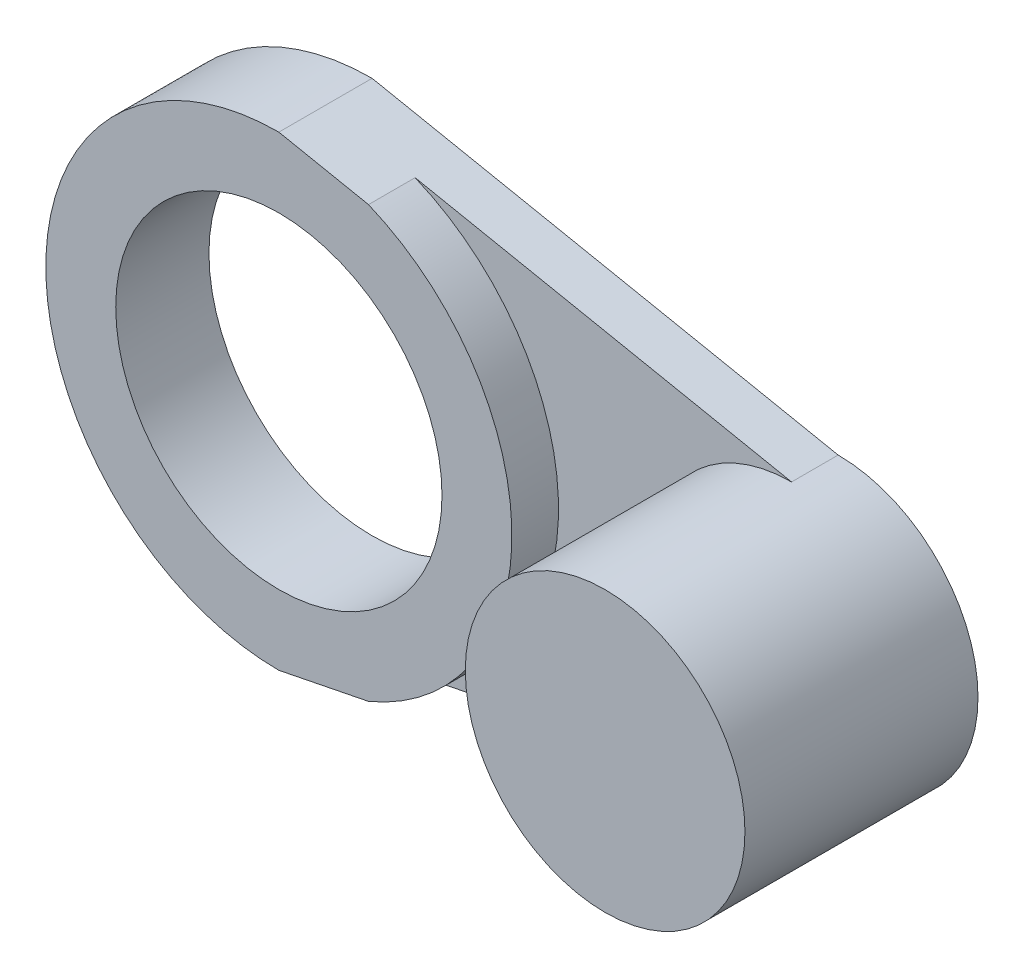
ISO-10303-21;
HEADER;
FILE_DESCRIPTION(('STEP AP214'),'2;1');
FILE_NAME('part.step','',(''),(''),'','','');
FILE_SCHEMA(('AUTOMOTIVE_DESIGN { 1 0 10303 214 1 1 1 1 }'));
ENDSEC;
DATA;
#1=APPLICATION_CONTEXT('core data for automotive mechanical design processes');
#2=APPLICATION_PROTOCOL_DEFINITION('international standard','automotive_design',2000,#1);
#3=PRODUCT_CONTEXT('',#1,'mechanical');
#4=PRODUCT('Part','Part','',(#3));
#5=PRODUCT_RELATED_PRODUCT_CATEGORY('part','',(#4));
#6=PRODUCT_DEFINITION_FORMATION('','',#4);
#7=PRODUCT_DEFINITION_CONTEXT('part definition',#1,'design');
#8=PRODUCT_DEFINITION('design','',#6,#7);
#9=PRODUCT_DEFINITION_SHAPE('','',#8);
#10=(LENGTH_UNIT() NAMED_UNIT(*) SI_UNIT(.MILLI.,.METRE.));
#11=(NAMED_UNIT(*) PLANE_ANGLE_UNIT() SI_UNIT($,.RADIAN.));
#12=(NAMED_UNIT(*) SI_UNIT($,.STERADIAN.) SOLID_ANGLE_UNIT());
#13=UNCERTAINTY_MEASURE_WITH_UNIT(LENGTH_MEASURE(1.E-05),#10,'distance_accuracy_value','');
#14=(GEOMETRIC_REPRESENTATION_CONTEXT(3) GLOBAL_UNCERTAINTY_ASSIGNED_CONTEXT((#13)) GLOBAL_UNIT_ASSIGNED_CONTEXT((#10,
#11,#12)) REPRESENTATION_CONTEXT('',''));
#15=CARTESIAN_POINT('',(0.,0.,0.));
#16=DIRECTION('',(0.,0.,1.));
#17=DIRECTION('',(1.,0.,0.));
#18=AXIS2_PLACEMENT_3D('',#15,#16,#17);
#19=CARTESIAN_POINT('',(4.80769230769231,-24.0384615384615,-5.));
#20=DIRECTION('',(0.196116135138184,-0.98058067569092,0.));
#21=DIRECTION('',(0.98058067569092,0.196116135138184,0.));
#22=AXIS2_PLACEMENT_3D('',#19,#20,#21);
#23=PLANE('',#22);
#24=DIRECTION('',(0.98058067569092,0.196116135138184,0.));
#25=VECTOR('',#24,1.);
#26=CARTESIAN_POINT('',(4.80769230769231,-24.0384615384615,0.));
#27=LINE('',#26,#25);
#28=CARTESIAN_POINT('',(9.61538461538463,-23.0769230769231,0.));
#29=VERTEX_POINT('',#28);
#30=CARTESIAN_POINT('',(50.,-15.,0.));
#31=VERTEX_POINT('',#30);
#32=EDGE_CURVE('E71',#29,#31,#27,.T.);
#33=ORIENTED_EDGE('',*,*,#32,.F.);
#34=DIRECTION('',(0.,0.,1.));
#35=VECTOR('',#34,1.);
#36=CARTESIAN_POINT('',(9.61538461538463,-23.0769230769231,-5.));
#37=LINE('',#36,#35);
#38=CARTESIAN_POINT('',(9.61538461538463,-23.0769230769231,5.));
#39=VERTEX_POINT('',#38);
#40=EDGE_CURVE('E128',#29,#39,#37,.T.);
#41=ORIENTED_EDGE('',*,*,#40,.T.);
#42=DIRECTION('',(0.98058067569092,0.196116135138184,0.));
#43=VECTOR('',#42,1.);
#44=CARTESIAN_POINT('',(4.80769230769231,-24.0384615384615,5.));
#45=LINE('',#44,#43);
#46=CARTESIAN_POINT('',(0.,-25.,5.));
#47=VERTEX_POINT('',#46);
#48=EDGE_CURVE('E109',#47,#39,#45,.T.);
#49=ORIENTED_EDGE('',*,*,#48,.F.);
#50=DIRECTION('',(0.,0.,1.));
#51=VECTOR('',#50,1.);
#52=CARTESIAN_POINT('',(0.,-25.,-5.));
#53=LINE('',#52,#51);
#54=CARTESIAN_POINT('',(0.,-25.,-5.));
#55=VERTEX_POINT('',#54);
#56=EDGE_CURVE('E100',#55,#47,#53,.T.);
#57=ORIENTED_EDGE('',*,*,#56,.F.);
#58=DIRECTION('',(0.98058067569092,0.196116135138184,0.));
#59=VECTOR('',#58,1.);
#60=CARTESIAN_POINT('',(4.80769230769231,-24.0384615384615,-5.));
#61=LINE('',#60,#59);
#62=CARTESIAN_POINT('',(50.,-15.,-5.));
#63=VERTEX_POINT('',#62);
#64=EDGE_CURVE('E52',#55,#63,#61,.T.);
#65=ORIENTED_EDGE('',*,*,#64,.T.);
#66=DIRECTION('',(0.,0.,1.));
#67=VECTOR('',#66,1.);
#68=CARTESIAN_POINT('',(50.,-15.,-5.));
#69=LINE('',#68,#67);
#70=EDGE_CURVE('E11',#63,#31,#69,.T.);
#71=ORIENTED_EDGE('',*,*,#70,.T.);
#72=EDGE_LOOP('',(#33,#41,#49,#57,#65,#71));
#73=FACE_BOUND('',#72,.T.);
#74=ADVANCED_FACE('F36',(#73),#23,.T.);
#75=CARTESIAN_POINT('',(4.80769230769231,24.0384615384615,-5.));
#76=DIRECTION('',(-0.196116135138184,-0.98058067569092,0.));
#77=DIRECTION('',(0.98058067569092,-0.196116135138184,0.));
#78=AXIS2_PLACEMENT_3D('',#75,#76,#77);
#79=PLANE('',#78);
#80=DIRECTION('',(0.98058067569092,-0.196116135138184,0.));
#81=VECTOR('',#80,1.);
#82=CARTESIAN_POINT('',(4.80769230769231,24.0384615384615,0.));
#83=LINE('',#82,#81);
#84=CARTESIAN_POINT('',(9.61538461538463,23.0769230769231,0.));
#85=VERTEX_POINT('',#84);
#86=CARTESIAN_POINT('',(50.,15.,0.));
#87=VERTEX_POINT('',#86);
#88=EDGE_CURVE('E64',#85,#87,#83,.T.);
#89=ORIENTED_EDGE('',*,*,#88,.T.);
#90=DIRECTION('',(0.,0.,1.));
#91=VECTOR('',#90,1.);
#92=CARTESIAN_POINT('',(50.,15.,-5.));
#93=LINE('',#92,#91);
#94=CARTESIAN_POINT('',(50.,15.,-5.));
#95=VERTEX_POINT('',#94);
#96=EDGE_CURVE('E40',#95,#87,#93,.T.);
#97=ORIENTED_EDGE('',*,*,#96,.F.);
#98=DIRECTION('',(0.98058067569092,-0.196116135138184,0.));
#99=VECTOR('',#98,1.);
#100=CARTESIAN_POINT('',(4.80769230769231,24.0384615384615,-5.));
#101=LINE('',#100,#99);
#102=CARTESIAN_POINT('',(0.,25.,-5.));
#103=VERTEX_POINT('',#102);
#104=EDGE_CURVE('E96',#103,#95,#101,.T.);
#105=ORIENTED_EDGE('',*,*,#104,.F.);
#106=DIRECTION('',(0.,0.,1.));
#107=VECTOR('',#106,1.);
#108=CARTESIAN_POINT('',(0.,25.,-5.));
#109=LINE('',#108,#107);
#110=CARTESIAN_POINT('',(0.,25.,5.));
#111=VERTEX_POINT('',#110);
#112=EDGE_CURVE('E92',#103,#111,#109,.T.);
#113=ORIENTED_EDGE('',*,*,#112,.T.);
#114=DIRECTION('',(0.98058067569092,-0.196116135138184,0.));
#115=VECTOR('',#114,1.);
#116=CARTESIAN_POINT('',(4.80769230769231,24.0384615384615,5.));
#117=LINE('',#116,#115);
#118=CARTESIAN_POINT('',(9.61538461538463,23.0769230769231,5.));
#119=VERTEX_POINT('',#118);
#120=EDGE_CURVE('E95',#111,#119,#117,.T.);
#121=ORIENTED_EDGE('',*,*,#120,.T.);
#122=DIRECTION('',(0.,0.,1.));
#123=VECTOR('',#122,1.);
#124=CARTESIAN_POINT('',(9.61538461538463,23.0769230769231,-5.));
#125=LINE('',#124,#123);
#126=EDGE_CURVE('E125',#85,#119,#125,.T.);
#127=ORIENTED_EDGE('',*,*,#126,.F.);
#128=EDGE_LOOP('',(#89,#97,#105,#113,#121,#127));
#129=FACE_BOUND('',#128,.T.);
#130=ADVANCED_FACE('F38',(#129),#79,.F.);
#131=CARTESIAN_POINT('',(0.,0.,-5.));
#132=DIRECTION('',(0.,0.,1.));
#133=DIRECTION('',(1.,0.,0.));
#134=AXIS2_PLACEMENT_3D('',#131,#132,#133);
#135=PLANE('',#134);
#136=ORIENTED_EDGE('',*,*,#104,.T.);
#137=CARTESIAN_POINT('',(50.,0.,-5.));
#138=DIRECTION('',(0.,0.,1.));
#139=DIRECTION('',(1.,0.,0.));
#140=AXIS2_PLACEMENT_3D('',#137,#138,#139);
#141=CIRCLE('',#140,15.);
#142=EDGE_CURVE('E133',#63,#95,#141,.T.);
#143=ORIENTED_EDGE('',*,*,#142,.F.);
#144=ORIENTED_EDGE('',*,*,#64,.F.);
#145=CARTESIAN_POINT('',(0.,0.,-5.));
#146=DIRECTION('',(0.,0.,1.));
#147=DIRECTION('',(1.,0.,0.));
#148=AXIS2_PLACEMENT_3D('',#145,#146,#147);
#149=CIRCLE('',#148,25.);
#150=EDGE_CURVE('E101',#103,#55,#149,.T.);
#151=ORIENTED_EDGE('',*,*,#150,.F.);
#152=EDGE_LOOP('',(#136,#143,#144,#151));
#153=FACE_BOUND('',#152,.T.);
#154=CARTESIAN_POINT('',(0.,0.,-5.));
#155=DIRECTION('',(0.,0.,1.));
#156=DIRECTION('',(1.,0.,0.));
#157=AXIS2_PLACEMENT_3D('',#154,#155,#156);
#158=CIRCLE('',#157,17.5);
#159=CARTESIAN_POINT('',(17.5,0.,-5.));
#160=VERTEX_POINT('',#159);
#161=EDGE_CURVE('E121',#160,#160,#158,.T.);
#162=ORIENTED_EDGE('',*,*,#161,.T.);
#163=EDGE_LOOP('',(#162));
#164=FACE_BOUND('',#163,.T.);
#165=ADVANCED_FACE('F155',(#153,#164),#135,.F.);
#166=CARTESIAN_POINT('',(0.,0.,0.));
#167=DIRECTION('',(0.,0.,1.));
#168=DIRECTION('',(1.,0.,0.));
#169=AXIS2_PLACEMENT_3D('',#166,#167,#168);
#170=PLANE('',#169);
#171=CARTESIAN_POINT('',(50.,0.,0.));
#172=DIRECTION('',(0.,0.,1.));
#173=DIRECTION('',(1.,0.,0.));
#174=AXIS2_PLACEMENT_3D('',#171,#172,#173);
#175=CIRCLE('',#174,15.);
#176=EDGE_CURVE('E136',#87,#31,#175,.T.);
#177=ORIENTED_EDGE('',*,*,#176,.F.);
#178=ORIENTED_EDGE('',*,*,#88,.F.);
#179=CARTESIAN_POINT('',(0.,0.,0.));
#180=DIRECTION('',(0.,0.,1.));
#181=DIRECTION('',(1.,0.,0.));
#182=AXIS2_PLACEMENT_3D('',#179,#180,#181);
#183=CIRCLE('',#182,25.);
#184=EDGE_CURVE('E142',#29,#85,#183,.T.);
#185=ORIENTED_EDGE('',*,*,#184,.F.);
#186=ORIENTED_EDGE('',*,*,#32,.T.);
#187=EDGE_LOOP('',(#177,#178,#185,#186));
#188=FACE_BOUND('',#187,.T.);
#189=ADVANCED_FACE('F148',(#188),#170,.T.);
#190=CARTESIAN_POINT('',(50.,0.,-5.));
#191=DIRECTION('',(0.,0.,1.));
#192=DIRECTION('',(1.,0.,0.));
#193=AXIS2_PLACEMENT_3D('',#190,#191,#192);
#194=CYLINDRICAL_SURFACE('',#193,15.);
#195=ORIENTED_EDGE('',*,*,#176,.T.);
#196=ORIENTED_EDGE('',*,*,#70,.F.);
#197=ORIENTED_EDGE('',*,*,#142,.T.);
#198=ORIENTED_EDGE('',*,*,#96,.T.);
#199=EDGE_LOOP('',(#195,#196,#197,#198));
#200=FACE_BOUND('',#199,.T.);
#201=CARTESIAN_POINT('',(50.,0.,20.));
#202=DIRECTION('',(0.,0.,1.));
#203=DIRECTION('',(1.,0.,0.));
#204=AXIS2_PLACEMENT_3D('',#201,#202,#203);
#205=CIRCLE('',#204,15.);
#206=CARTESIAN_POINT('',(65.,0.,20.));
#207=VERTEX_POINT('',#206);
#208=EDGE_CURVE('E127',#207,#207,#205,.T.);
#209=ORIENTED_EDGE('',*,*,#208,.F.);
#210=EDGE_LOOP('',(#209));
#211=FACE_BOUND('',#210,.T.);
#212=ADVANCED_FACE('F152',(#200,#211),#194,.T.);
#213=CARTESIAN_POINT('',(0.,0.,20.));
#214=DIRECTION('',(0.,0.,1.));
#215=DIRECTION('',(1.,0.,0.));
#216=AXIS2_PLACEMENT_3D('',#213,#214,#215);
#217=PLANE('',#216);
#218=ORIENTED_EDGE('',*,*,#208,.T.);
#219=EDGE_LOOP('',(#218));
#220=FACE_BOUND('',#219,.T.);
#221=ADVANCED_FACE('F182',(#220),#217,.T.);
#222=CARTESIAN_POINT('',(0.,0.,-5.));
#223=DIRECTION('',(0.,0.,1.));
#224=DIRECTION('',(1.,0.,0.));
#225=AXIS2_PLACEMENT_3D('',#222,#223,#224);
#226=CYLINDRICAL_SURFACE('',#225,25.);
#227=ORIENTED_EDGE('',*,*,#40,.F.);
#228=ORIENTED_EDGE('',*,*,#184,.T.);
#229=ORIENTED_EDGE('',*,*,#126,.T.);
#230=CARTESIAN_POINT('',(0.,0.,5.));
#231=DIRECTION('',(0.,0.,1.));
#232=DIRECTION('',(1.,0.,0.));
#233=AXIS2_PLACEMENT_3D('',#230,#231,#232);
#234=CIRCLE('',#233,25.);
#235=EDGE_CURVE('E111',#39,#119,#234,.T.);
#236=ORIENTED_EDGE('',*,*,#235,.F.);
#237=EDGE_LOOP('',(#227,#228,#229,#236));
#238=FACE_BOUND('',#237,.T.);
#239=ADVANCED_FACE('F147',(#238),#226,.T.);
#240=CARTESIAN_POINT('',(0.,0.,-5.));
#241=DIRECTION('',(0.,0.,1.));
#242=DIRECTION('',(1.,0.,0.));
#243=AXIS2_PLACEMENT_3D('',#240,#241,#242);
#244=CYLINDRICAL_SURFACE('',#243,17.5);
#245=ORIENTED_EDGE('',*,*,#161,.F.);
#246=EDGE_LOOP('',(#245));
#247=FACE_BOUND('',#246,.T.);
#248=CARTESIAN_POINT('',(0.,0.,5.));
#249=DIRECTION('',(0.,0.,1.));
#250=DIRECTION('',(1.,0.,0.));
#251=AXIS2_PLACEMENT_3D('',#248,#249,#250);
#252=CIRCLE('',#251,17.5);
#253=CARTESIAN_POINT('',(17.5,0.,5.));
#254=VERTEX_POINT('',#253);
#255=EDGE_CURVE('E115',#254,#254,#252,.T.);
#256=ORIENTED_EDGE('',*,*,#255,.T.);
#257=EDGE_LOOP('',(#256));
#258=FACE_BOUND('',#257,.T.);
#259=ADVANCED_FACE('F161',(#247,#258),#244,.F.);
#260=ORIENTED_EDGE('',*,*,#56,.T.);
#261=EDGE_CURVE('E104',#111,#47,#234,.T.);
#262=ORIENTED_EDGE('',*,*,#261,.F.);
#263=ORIENTED_EDGE('',*,*,#112,.F.);
#264=ORIENTED_EDGE('',*,*,#150,.T.);
#265=EDGE_LOOP('',(#260,#262,#263,#264));
#266=FACE_BOUND('',#265,.T.);
#267=ADVANCED_FACE('F105',(#266),#226,.T.);
#268=CARTESIAN_POINT('',(0.,0.,5.));
#269=DIRECTION('',(0.,0.,1.));
#270=DIRECTION('',(1.,0.,0.));
#271=AXIS2_PLACEMENT_3D('',#268,#269,#270);
#272=PLANE('',#271);
#273=ORIENTED_EDGE('',*,*,#255,.F.);
#274=EDGE_LOOP('',(#273));
#275=FACE_BOUND('',#274,.T.);
#276=ORIENTED_EDGE('',*,*,#120,.F.);
#277=ORIENTED_EDGE('',*,*,#261,.T.);
#278=ORIENTED_EDGE('',*,*,#48,.T.);
#279=ORIENTED_EDGE('',*,*,#235,.T.);
#280=EDGE_LOOP('',(#276,#277,#278,#279));
#281=FACE_BOUND('',#280,.T.);
#282=ADVANCED_FACE('F113',(#275,#281),#272,.T.);
#283=CLOSED_SHELL('',(#74,#130,#165,#189,#212,#221,#239,#259,#267,#282));
#284=MANIFOLD_SOLID_BREP('B2',#283);
#285=ADVANCED_BREP_SHAPE_REPRESENTATION('',(#18,#284),#14);
#286=SHAPE_DEFINITION_REPRESENTATION(#9,#285);
ENDSEC;
END-ISO-10303-21;
